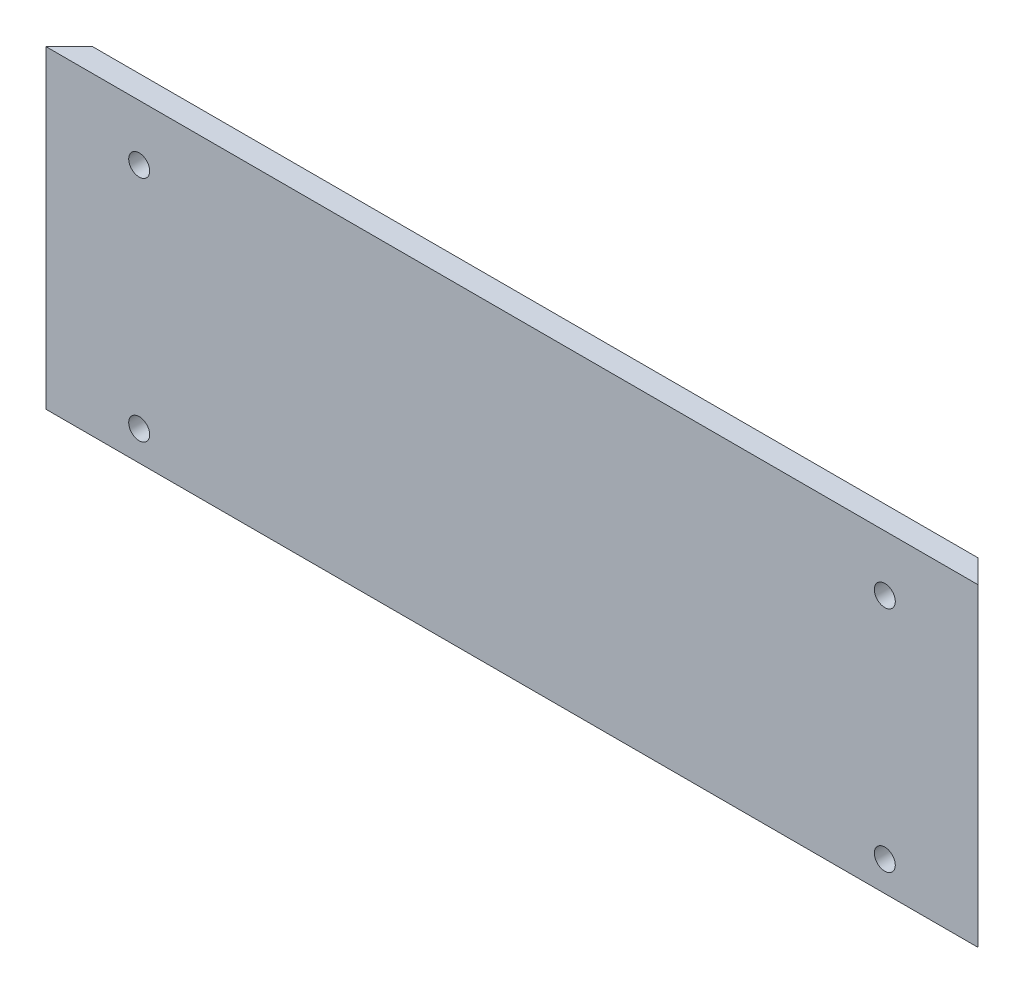
ISO-10303-21;
HEADER;
FILE_DESCRIPTION(('STEP AP214'),'2;1');
FILE_NAME('part.step','',(''),(''),'','','');
FILE_SCHEMA(('AUTOMOTIVE_DESIGN { 1 0 10303 214 1 1 1 1 }'));
ENDSEC;
DATA;
#1=APPLICATION_CONTEXT('core data for automotive mechanical design processes');
#2=APPLICATION_PROTOCOL_DEFINITION('international standard','automotive_design',2000,#1);
#3=PRODUCT_CONTEXT('',#1,'mechanical');
#4=PRODUCT('Part','Part','',(#3));
#5=PRODUCT_RELATED_PRODUCT_CATEGORY('part','',(#4));
#6=PRODUCT_DEFINITION_FORMATION('','',#4);
#7=PRODUCT_DEFINITION_CONTEXT('part definition',#1,'design');
#8=PRODUCT_DEFINITION('design','',#6,#7);
#9=PRODUCT_DEFINITION_SHAPE('','',#8);
#10=(LENGTH_UNIT() NAMED_UNIT(*) SI_UNIT(.MILLI.,.METRE.));
#11=(NAMED_UNIT(*) PLANE_ANGLE_UNIT() SI_UNIT($,.RADIAN.));
#12=(NAMED_UNIT(*) SI_UNIT($,.STERADIAN.) SOLID_ANGLE_UNIT());
#13=UNCERTAINTY_MEASURE_WITH_UNIT(LENGTH_MEASURE(1.E-05),#10,'distance_accuracy_value','');
#14=(GEOMETRIC_REPRESENTATION_CONTEXT(3) GLOBAL_UNCERTAINTY_ASSIGNED_CONTEXT((#13)) GLOBAL_UNIT_ASSIGNED_CONTEXT((#10,
#11,#12)) REPRESENTATION_CONTEXT('',''));
#15=CARTESIAN_POINT('',(0.,0.,0.));
#16=DIRECTION('',(0.,0.,1.));
#17=DIRECTION('',(1.,0.,0.));
#18=AXIS2_PLACEMENT_3D('',#15,#16,#17);
#19=CARTESIAN_POINT('',(0.,70.,-5.));
#20=DIRECTION('',(0.,1.,0.));
#21=DIRECTION('',(0.,0.,1.));
#22=AXIS2_PLACEMENT_3D('',#19,#20,#21);
#23=PLANE('',#22);
#24=DIRECTION('',(-0.707106781186548,0.,-0.707106781186548));
#25=VECTOR('',#24,1.);
#26=CARTESIAN_POINT('',(97.5,70.,-102.5));
#27=LINE('',#26,#25);
#28=CARTESIAN_POINT('',(200.,70.,0.));
#29=VERTEX_POINT('',#28);
#30=CARTESIAN_POINT('',(195.,70.,-4.99999999999999));
#31=VERTEX_POINT('',#30);
#32=EDGE_CURVE('E120',#29,#31,#27,.T.);
#33=ORIENTED_EDGE('',*,*,#32,.T.);
#34=DIRECTION('',(-1.,0.,0.));
#35=VECTOR('',#34,1.);
#36=CARTESIAN_POINT('',(8.00000000000009,70.,-5.));
#37=LINE('',#36,#35);
#38=CARTESIAN_POINT('',(5.00000000000003,70.,-5.));
#39=VERTEX_POINT('',#38);
#40=EDGE_CURVE('E61',#31,#39,#37,.T.);
#41=ORIENTED_EDGE('',*,*,#40,.T.);
#42=DIRECTION('',(-0.707106781186548,0.,0.707106781186548));
#43=VECTOR('',#42,1.);
#44=CARTESIAN_POINT('',(2.50000000000002,70.,-2.49999999999998));
#45=LINE('',#44,#43);
#46=CARTESIAN_POINT('',(0.,70.,0.));
#47=VERTEX_POINT('',#46);
#48=EDGE_CURVE('E117',#39,#47,#45,.T.);
#49=ORIENTED_EDGE('',*,*,#48,.T.);
#50=DIRECTION('',(-1.,0.,0.));
#51=VECTOR('',#50,1.);
#52=CARTESIAN_POINT('',(0.,70.,0.));
#53=LINE('',#52,#51);
#54=EDGE_CURVE('E150',#29,#47,#53,.T.);
#55=ORIENTED_EDGE('',*,*,#54,.F.);
#56=EDGE_LOOP('',(#33,#41,#49,#55));
#57=FACE_BOUND('',#56,.T.);
#58=ADVANCED_FACE('F38',(#57),#23,.T.);
#59=CARTESIAN_POINT('',(0.,0.,-5.));
#60=DIRECTION('',(0.,0.,-1.));
#61=DIRECTION('',(-1.,0.,0.));
#62=AXIS2_PLACEMENT_3D('',#59,#60,#61);
#63=PLANE('',#62);
#64=DIRECTION('',(1.,0.,0.));
#65=VECTOR('',#64,1.);
#66=CARTESIAN_POINT('',(-5.,2.59999999999997,-4.99999999999971));
#67=LINE('',#66,#65);
#68=CARTESIAN_POINT('',(4.99999999999975,2.59999999999997,-4.99999999999971));
#69=VERTEX_POINT('',#68);
#70=CARTESIAN_POINT('',(195.,2.59999999999997,-4.99999999999971));
#71=VERTEX_POINT('',#70);
#72=EDGE_CURVE('E96',#69,#71,#67,.T.);
#73=ORIENTED_EDGE('',*,*,#72,.F.);
#74=DIRECTION('',(0.,1.,0.));
#75=VECTOR('',#74,1.);
#76=CARTESIAN_POINT('',(5.00000000000003,0.,-5.));
#77=LINE('',#76,#75);
#78=CARTESIAN_POINT('',(5.00000000000003,5.,-5.));
#79=VERTEX_POINT('',#78);
#80=EDGE_CURVE('E118',#69,#79,#77,.T.);
#81=ORIENTED_EDGE('',*,*,#80,.T.);
#82=DIRECTION('',(-1.,0.,0.));
#83=VECTOR('',#82,1.);
#84=CARTESIAN_POINT('',(0.,5.,-5.));
#85=LINE('',#84,#83);
#86=CARTESIAN_POINT('',(195.,4.99999999999996,-5.));
#87=VERTEX_POINT('',#86);
#88=EDGE_CURVE('E116',#87,#79,#85,.T.);
#89=ORIENTED_EDGE('',*,*,#88,.F.);
#90=DIRECTION('',(0.,-1.,0.));
#91=VECTOR('',#90,1.);
#92=CARTESIAN_POINT('',(195.,0.,-5.));
#93=LINE('',#92,#91);
#94=EDGE_CURVE('E109',#87,#71,#93,.T.);
#95=ORIENTED_EDGE('',*,*,#94,.T.);
#96=EDGE_LOOP('',(#73,#81,#89,#95));
#97=FACE_BOUND('',#96,.T.);
#98=ADVANCED_FACE('F114',(#97),#63,.T.);
#99=CARTESIAN_POINT('',(0.,0.,0.));
#100=DIRECTION('',(0.,0.,-1.));
#101=DIRECTION('',(-1.,0.,0.));
#102=AXIS2_PLACEMENT_3D('',#99,#100,#101);
#103=PLANE('',#102);
#104=CARTESIAN_POINT('',(180.,58.,0.));
#105=DIRECTION('',(0.,0.,1.));
#106=DIRECTION('',(-1.,0.,0.));
#107=AXIS2_PLACEMENT_3D('',#104,#105,#106);
#108=CIRCLE('',#107,2.25000000000001);
#109=CARTESIAN_POINT('',(177.75,58.,0.));
#110=VERTEX_POINT('',#109);
#111=EDGE_CURVE('E165',#110,#110,#108,.T.);
#112=ORIENTED_EDGE('',*,*,#111,.F.);
#113=EDGE_LOOP('',(#112));
#114=FACE_BOUND('',#113,.T.);
#115=CARTESIAN_POINT('',(20.,58.,0.));
#116=DIRECTION('',(0.,0.,1.));
#117=DIRECTION('',(1.,0.,0.));
#118=AXIS2_PLACEMENT_3D('',#115,#116,#117);
#119=CIRCLE('',#118,2.25);
#120=CARTESIAN_POINT('',(22.25,58.,0.));
#121=VERTEX_POINT('',#120);
#122=EDGE_CURVE('E168',#121,#121,#119,.T.);
#123=ORIENTED_EDGE('',*,*,#122,.F.);
#124=EDGE_LOOP('',(#123));
#125=FACE_BOUND('',#124,.T.);
#126=CARTESIAN_POINT('',(180.,9.,0.));
#127=DIRECTION('',(0.,0.,1.));
#128=DIRECTION('',(-1.,0.,0.));
#129=AXIS2_PLACEMENT_3D('',#126,#127,#128);
#130=CIRCLE('',#129,2.25000000000001);
#131=CARTESIAN_POINT('',(177.75,9.,0.));
#132=VERTEX_POINT('',#131);
#133=EDGE_CURVE('E177',#132,#132,#130,.T.);
#134=ORIENTED_EDGE('',*,*,#133,.F.);
#135=EDGE_LOOP('',(#134));
#136=FACE_BOUND('',#135,.T.);
#137=CARTESIAN_POINT('',(20.,9.,0.));
#138=DIRECTION('',(0.,0.,1.));
#139=DIRECTION('',(1.,0.,0.));
#140=AXIS2_PLACEMENT_3D('',#137,#138,#139);
#141=CIRCLE('',#140,2.25);
#142=CARTESIAN_POINT('',(22.25,9.,0.));
#143=VERTEX_POINT('',#142);
#144=EDGE_CURVE('E180',#143,#143,#141,.T.);
#145=ORIENTED_EDGE('',*,*,#144,.F.);
#146=EDGE_LOOP('',(#145));
#147=FACE_BOUND('',#146,.T.);
#148=DIRECTION('',(0.,-1.,0.));
#149=VECTOR('',#148,1.);
#150=CARTESIAN_POINT('',(0.,0.,0.));
#151=LINE('',#150,#149);
#152=CARTESIAN_POINT('',(0.,2.59999999999997,0.));
#153=VERTEX_POINT('',#152);
#154=EDGE_CURVE('E157',#47,#153,#151,.T.);
#155=ORIENTED_EDGE('',*,*,#154,.T.);
#156=DIRECTION('',(1.,0.,0.));
#157=VECTOR('',#156,1.);
#158=CARTESIAN_POINT('',(0.,2.59999999999997,3.33066907387547E-13));
#159=LINE('',#158,#157);
#160=CARTESIAN_POINT('',(200.,2.59999999999997,3.33066907387547E-13));
#161=VERTEX_POINT('',#160);
#162=EDGE_CURVE('E53',#153,#161,#159,.T.);
#163=ORIENTED_EDGE('',*,*,#162,.T.);
#164=DIRECTION('',(0.,1.,0.));
#165=VECTOR('',#164,1.);
#166=CARTESIAN_POINT('',(200.,0.,0.));
#167=LINE('',#166,#165);
#168=EDGE_CURVE('E111',#161,#29,#167,.T.);
#169=ORIENTED_EDGE('',*,*,#168,.T.);
#170=ORIENTED_EDGE('',*,*,#54,.T.);
#171=EDGE_LOOP('',(#155,#163,#169,#170));
#172=FACE_BOUND('',#171,.T.);
#173=ADVANCED_FACE('F182',(#114,#125,#136,#147,#172),#103,.F.);
#174=CARTESIAN_POINT('',(20.,9.,-5.));
#175=DIRECTION('',(0.,0.,1.));
#176=DIRECTION('',(1.,0.,0.));
#177=AXIS2_PLACEMENT_3D('',#174,#175,#176);
#178=CYLINDRICAL_SURFACE('',#177,2.25);
#179=ORIENTED_EDGE('',*,*,#144,.T.);
#180=EDGE_LOOP('',(#179));
#181=FACE_BOUND('',#180,.T.);
#182=CARTESIAN_POINT('',(20.,9.,-8.));
#183=DIRECTION('',(0.,0.,-1.));
#184=DIRECTION('',(-1.,0.,0.));
#185=AXIS2_PLACEMENT_3D('',#182,#183,#184);
#186=CIRCLE('',#185,2.25);
#187=CARTESIAN_POINT('',(17.75,9.,-8.));
#188=VERTEX_POINT('',#187);
#189=EDGE_CURVE('E190',#188,#188,#186,.T.);
#190=ORIENTED_EDGE('',*,*,#189,.T.);
#191=EDGE_LOOP('',(#190));
#192=FACE_BOUND('',#191,.T.);
#193=ADVANCED_FACE('F282',(#181,#192),#178,.F.);
#194=CARTESIAN_POINT('',(180.,9.,-5.));
#195=DIRECTION('',(0.,0.,1.));
#196=DIRECTION('',(1.,0.,0.));
#197=AXIS2_PLACEMENT_3D('',#194,#195,#196);
#198=CYLINDRICAL_SURFACE('',#197,2.25000000000001);
#199=ORIENTED_EDGE('',*,*,#133,.T.);
#200=EDGE_LOOP('',(#199));
#201=FACE_BOUND('',#200,.T.);
#202=CARTESIAN_POINT('',(180.,9.,-8.));
#203=DIRECTION('',(0.,0.,-1.));
#204=DIRECTION('',(-1.,0.,0.));
#205=AXIS2_PLACEMENT_3D('',#202,#203,#204);
#206=CIRCLE('',#205,2.25000000000001);
#207=CARTESIAN_POINT('',(177.75,9.,-8.));
#208=VERTEX_POINT('',#207);
#209=EDGE_CURVE('E186',#208,#208,#206,.T.);
#210=ORIENTED_EDGE('',*,*,#209,.T.);
#211=EDGE_LOOP('',(#210));
#212=FACE_BOUND('',#211,.T.);
#213=ADVANCED_FACE('F213',(#201,#212),#198,.F.);
#214=CARTESIAN_POINT('',(20.,58.,-5.));
#215=DIRECTION('',(0.,0.,1.));
#216=DIRECTION('',(1.,0.,0.));
#217=AXIS2_PLACEMENT_3D('',#214,#215,#216);
#218=CYLINDRICAL_SURFACE('',#217,2.25);
#219=ORIENTED_EDGE('',*,*,#122,.T.);
#220=EDGE_LOOP('',(#219));
#221=FACE_BOUND('',#220,.T.);
#222=CARTESIAN_POINT('',(20.,58.,-8.));
#223=DIRECTION('',(0.,0.,-1.));
#224=DIRECTION('',(-1.,0.,0.));
#225=AXIS2_PLACEMENT_3D('',#222,#223,#224);
#226=CIRCLE('',#225,2.25000000000001);
#227=CARTESIAN_POINT('',(17.75,58.,-8.));
#228=VERTEX_POINT('',#227);
#229=EDGE_CURVE('E170',#228,#228,#226,.T.);
#230=ORIENTED_EDGE('',*,*,#229,.T.);
#231=EDGE_LOOP('',(#230));
#232=FACE_BOUND('',#231,.T.);
#233=ADVANCED_FACE('F197',(#221,#232),#218,.F.);
#234=CARTESIAN_POINT('',(180.,58.,-5.));
#235=DIRECTION('',(0.,0.,1.));
#236=DIRECTION('',(1.,0.,0.));
#237=AXIS2_PLACEMENT_3D('',#234,#235,#236);
#238=CYLINDRICAL_SURFACE('',#237,2.25000000000001);
#239=ORIENTED_EDGE('',*,*,#111,.T.);
#240=EDGE_LOOP('',(#239));
#241=FACE_BOUND('',#240,.T.);
#242=CARTESIAN_POINT('',(180.,58.,-8.));
#243=DIRECTION('',(0.,0.,-1.));
#244=DIRECTION('',(-1.,0.,0.));
#245=AXIS2_PLACEMENT_3D('',#242,#243,#244);
#246=CIRCLE('',#245,2.25000000000001);
#247=CARTESIAN_POINT('',(177.75,58.,-8.));
#248=VERTEX_POINT('',#247);
#249=EDGE_CURVE('E183',#248,#248,#246,.T.);
#250=ORIENTED_EDGE('',*,*,#249,.T.);
#251=EDGE_LOOP('',(#250));
#252=FACE_BOUND('',#251,.T.);
#253=ADVANCED_FACE('F200',(#241,#252),#238,.F.);
#254=CARTESIAN_POINT('',(0.,0.,-8.));
#255=DIRECTION('',(0.,0.,1.));
#256=DIRECTION('',(1.,0.,0.));
#257=AXIS2_PLACEMENT_3D('',#254,#255,#256);
#258=PLANE('',#257);
#259=DIRECTION('',(0.,1.,0.));
#260=VECTOR('',#259,1.);
#261=CARTESIAN_POINT('',(8.00000000000004,70.,-8.));
#262=LINE('',#261,#260);
#263=CARTESIAN_POINT('',(8.00000000000004,5.,-8.));
#264=VERTEX_POINT('',#263);
#265=CARTESIAN_POINT('',(8.00000000000004,67.,-8.));
#266=VERTEX_POINT('',#265);
#267=EDGE_CURVE('E138',#264,#266,#262,.T.);
#268=ORIENTED_EDGE('',*,*,#267,.T.);
#269=DIRECTION('',(1.,0.,0.));
#270=VECTOR('',#269,1.);
#271=CARTESIAN_POINT('',(192.,67.,-8.));
#272=LINE('',#271,#270);
#273=CARTESIAN_POINT('',(192.,67.,-8.));
#274=VERTEX_POINT('',#273);
#275=EDGE_CURVE('E127',#266,#274,#272,.T.);
#276=ORIENTED_EDGE('',*,*,#275,.T.);
#277=DIRECTION('',(0.,-1.,0.));
#278=VECTOR('',#277,1.);
#279=CARTESIAN_POINT('',(192.,4.99999999999996,-8.));
#280=LINE('',#279,#278);
#281=CARTESIAN_POINT('',(192.,4.99999999999997,-8.));
#282=VERTEX_POINT('',#281);
#283=EDGE_CURVE('E149',#274,#282,#280,.T.);
#284=ORIENTED_EDGE('',*,*,#283,.T.);
#285=DIRECTION('',(-1.,0.,0.));
#286=VECTOR('',#285,1.);
#287=CARTESIAN_POINT('',(0.,5.,-8.));
#288=LINE('',#287,#286);
#289=EDGE_CURVE('E148',#282,#264,#288,.T.);
#290=ORIENTED_EDGE('',*,*,#289,.T.);
#291=EDGE_LOOP('',(#268,#276,#284,#290));
#292=FACE_BOUND('',#291,.T.);
#293=ORIENTED_EDGE('',*,*,#229,.F.);
#294=EDGE_LOOP('',(#293));
#295=FACE_BOUND('',#294,.T.);
#296=ORIENTED_EDGE('',*,*,#189,.F.);
#297=EDGE_LOOP('',(#296));
#298=FACE_BOUND('',#297,.T.);
#299=ORIENTED_EDGE('',*,*,#209,.F.);
#300=EDGE_LOOP('',(#299));
#301=FACE_BOUND('',#300,.T.);
#302=ORIENTED_EDGE('',*,*,#249,.F.);
#303=EDGE_LOOP('',(#302));
#304=FACE_BOUND('',#303,.T.);
#305=ADVANCED_FACE('F144',(#292,#295,#298,#301,#304),#258,.F.);
#306=CARTESIAN_POINT('',(0.,5.,-8.));
#307=DIRECTION('',(0.,1.,0.));
#308=DIRECTION('',(-1.,0.,0.));
#309=AXIS2_PLACEMENT_3D('',#306,#307,#308);
#310=PLANE('',#309);
#311=ORIENTED_EDGE('',*,*,#289,.F.);
#312=DIRECTION('',(0.707106781186548,0.,0.707106781186548));
#313=VECTOR('',#312,1.);
#314=CARTESIAN_POINT('',(192.,4.99999999999997,-8.));
#315=LINE('',#314,#313);
#316=EDGE_CURVE('E122',#282,#87,#315,.T.);
#317=ORIENTED_EDGE('',*,*,#316,.T.);
#318=ORIENTED_EDGE('',*,*,#88,.T.);
#319=DIRECTION('',(0.707106781186548,0.,-0.707106781186548));
#320=VECTOR('',#319,1.);
#321=CARTESIAN_POINT('',(8.00000000000004,5.,-8.));
#322=LINE('',#321,#320);
#323=EDGE_CURVE('E162',#79,#264,#322,.T.);
#324=ORIENTED_EDGE('',*,*,#323,.T.);
#325=EDGE_LOOP('',(#311,#317,#318,#324));
#326=FACE_BOUND('',#325,.T.);
#327=ADVANCED_FACE('F164',(#326),#310,.F.);
#328=CARTESIAN_POINT('',(192.,0.,-8.));
#329=DIRECTION('',(0.707106781186548,0.,-0.707106781186548));
#330=DIRECTION('',(0.,1.,0.));
#331=AXIS2_PLACEMENT_3D('',#328,#329,#330);
#332=PLANE('',#331);
#333=DIRECTION('',(0.707106781186544,0.,0.70710678118655));
#334=VECTOR('',#333,1.);
#335=CARTESIAN_POINT('',(200.,2.59999999999997,3.33066907387547E-13));
#336=LINE('',#335,#334);
#337=EDGE_CURVE('E99',#71,#161,#336,.T.);
#338=ORIENTED_EDGE('',*,*,#337,.F.);
#339=ORIENTED_EDGE('',*,*,#94,.F.);
#340=ORIENTED_EDGE('',*,*,#316,.F.);
#341=ORIENTED_EDGE('',*,*,#283,.F.);
#342=DIRECTION('',(0.577350269189625,0.577350269189626,0.577350269189626));
#343=VECTOR('',#342,1.);
#344=CARTESIAN_POINT('',(169.666666666667,44.6666666666667,-30.3333333333333));
#345=LINE('',#344,#343);
#346=EDGE_CURVE('E130',#274,#31,#345,.T.);
#347=ORIENTED_EDGE('',*,*,#346,.T.);
#348=ORIENTED_EDGE('',*,*,#32,.F.);
#349=ORIENTED_EDGE('',*,*,#168,.F.);
#350=EDGE_LOOP('',(#338,#339,#340,#341,#347,#348,#349));
#351=FACE_BOUND('',#350,.T.);
#352=ADVANCED_FACE('F107',(#351),#332,.T.);
#353=CARTESIAN_POINT('',(8.00000000000004,0.,-8.));
#354=DIRECTION('',(-0.707106781186548,0.,-0.707106781186548));
#355=DIRECTION('',(0.,-1.,0.));
#356=AXIS2_PLACEMENT_3D('',#353,#354,#355);
#357=PLANE('',#356);
#358=DIRECTION('',(0.707106781186548,0.,-0.707106781186548));
#359=VECTOR('',#358,1.);
#360=CARTESIAN_POINT('',(8.00000000000004,2.59999999999997,-8.));
#361=LINE('',#360,#359);
#362=EDGE_CURVE('E11',#153,#69,#361,.T.);
#363=ORIENTED_EDGE('',*,*,#362,.F.);
#364=ORIENTED_EDGE('',*,*,#154,.F.);
#365=ORIENTED_EDGE('',*,*,#48,.F.);
#366=DIRECTION('',(0.577350269189626,-0.577350269189626,-0.577350269189626));
#367=VECTOR('',#366,1.);
#368=CARTESIAN_POINT('',(30.3333333333334,44.6666666666666,-30.3333333333333));
#369=LINE('',#368,#367);
#370=EDGE_CURVE('E47',#39,#266,#369,.T.);
#371=ORIENTED_EDGE('',*,*,#370,.T.);
#372=ORIENTED_EDGE('',*,*,#267,.F.);
#373=ORIENTED_EDGE('',*,*,#323,.F.);
#374=ORIENTED_EDGE('',*,*,#80,.F.);
#375=EDGE_LOOP('',(#363,#364,#365,#371,#372,#373,#374));
#376=FACE_BOUND('',#375,.T.);
#377=ADVANCED_FACE('F136',(#376),#357,.T.);
#378=CARTESIAN_POINT('',(0.,67.,-8.));
#379=DIRECTION('',(0.,0.707106781186547,-0.707106781186548));
#380=DIRECTION('',(-1.,0.,0.));
#381=AXIS2_PLACEMENT_3D('',#378,#379,#380);
#382=PLANE('',#381);
#383=ORIENTED_EDGE('',*,*,#370,.F.);
#384=ORIENTED_EDGE('',*,*,#40,.F.);
#385=ORIENTED_EDGE('',*,*,#346,.F.);
#386=ORIENTED_EDGE('',*,*,#275,.F.);
#387=EDGE_LOOP('',(#383,#384,#385,#386));
#388=FACE_BOUND('',#387,.T.);
#389=ADVANCED_FACE('F41',(#388),#382,.T.);
#390=CARTESIAN_POINT('',(0.,2.59999999999997,3.33066907387547E-13));
#391=DIRECTION('',(0.,1.,0.));
#392=DIRECTION('',(-1.,0.,0.));
#393=AXIS2_PLACEMENT_3D('',#390,#391,#392);
#394=PLANE('',#393);
#395=ORIENTED_EDGE('',*,*,#362,.T.);
#396=ORIENTED_EDGE('',*,*,#72,.T.);
#397=ORIENTED_EDGE('',*,*,#337,.T.);
#398=ORIENTED_EDGE('',*,*,#162,.F.);
#399=EDGE_LOOP('',(#395,#396,#397,#398));
#400=FACE_BOUND('',#399,.T.);
#401=ADVANCED_FACE('F98',(#400),#394,.F.);
#402=CLOSED_SHELL('',(#58,#98,#173,#193,#213,#233,#253,#305,#327,#352,#377,#389,#401));
#403=MANIFOLD_SOLID_BREP('B2',#402);
#404=ADVANCED_BREP_SHAPE_REPRESENTATION('',(#18,#403),#14);
#405=SHAPE_DEFINITION_REPRESENTATION(#9,#404);
ENDSEC;
END-ISO-10303-21;
